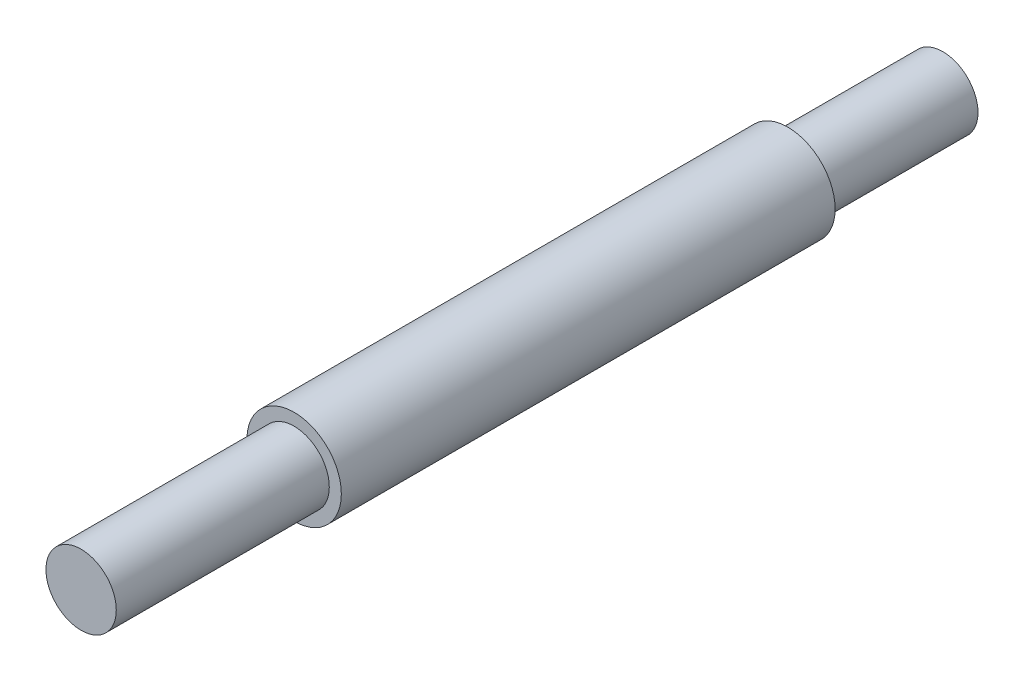
ISO-10303-21;
HEADER;
FILE_DESCRIPTION(('STEP AP214'),'2;1');
FILE_NAME('part.step','',(''),(''),'','','');
FILE_SCHEMA(('AUTOMOTIVE_DESIGN { 1 0 10303 214 1 1 1 1 }'));
ENDSEC;
DATA;
#1=APPLICATION_CONTEXT('core data for automotive mechanical design processes');
#2=APPLICATION_PROTOCOL_DEFINITION('international standard','automotive_design',2000,#1);
#3=PRODUCT_CONTEXT('',#1,'mechanical');
#4=PRODUCT('Part','Part','',(#3));
#5=PRODUCT_RELATED_PRODUCT_CATEGORY('part','',(#4));
#6=PRODUCT_DEFINITION_FORMATION('','',#4);
#7=PRODUCT_DEFINITION_CONTEXT('part definition',#1,'design');
#8=PRODUCT_DEFINITION('design','',#6,#7);
#9=PRODUCT_DEFINITION_SHAPE('','',#8);
#10=(LENGTH_UNIT() NAMED_UNIT(*) SI_UNIT(.MILLI.,.METRE.));
#11=(NAMED_UNIT(*) PLANE_ANGLE_UNIT() SI_UNIT($,.RADIAN.));
#12=(NAMED_UNIT(*) SI_UNIT($,.STERADIAN.) SOLID_ANGLE_UNIT());
#13=UNCERTAINTY_MEASURE_WITH_UNIT(LENGTH_MEASURE(1.E-05),#10,'distance_accuracy_value','');
#14=(GEOMETRIC_REPRESENTATION_CONTEXT(3) GLOBAL_UNCERTAINTY_ASSIGNED_CONTEXT((#13)) GLOBAL_UNIT_ASSIGNED_CONTEXT((#10,
#11,#12)) REPRESENTATION_CONTEXT('',''));
#15=CARTESIAN_POINT('',(0.,0.,0.));
#16=DIRECTION('',(0.,0.,1.));
#17=DIRECTION('',(1.,0.,0.));
#18=AXIS2_PLACEMENT_3D('',#15,#16,#17);
#19=CARTESIAN_POINT('',(0.,0.,25.49906));
#20=DIRECTION('',(0.,0.,1.));
#21=DIRECTION('',(1.,0.,0.));
#22=AXIS2_PLACEMENT_3D('',#19,#20,#21);
#23=PLANE('',#22);
#24=CARTESIAN_POINT('',(0.,0.,25.49906));
#25=DIRECTION('',(0.,0.,1.));
#26=DIRECTION('',(1.,0.,0.));
#27=AXIS2_PLACEMENT_3D('',#24,#25,#26);
#28=CIRCLE('',#27,1.8161);
#29=CARTESIAN_POINT('',(1.8161,0.,25.49906));
#30=VERTEX_POINT('',#29);
#31=EDGE_CURVE('E69',#30,#30,#28,.T.);
#32=ORIENTED_EDGE('',*,*,#31,.F.);
#33=EDGE_LOOP('',(#32));
#34=FACE_BOUND('',#33,.T.);
#35=CARTESIAN_POINT('',(0.,0.,25.49906));
#36=DIRECTION('',(0.,0.,1.));
#37=DIRECTION('',(1.,0.,0.));
#38=AXIS2_PLACEMENT_3D('',#35,#36,#37);
#39=CIRCLE('',#38,2.4384);
#40=CARTESIAN_POINT('',(2.4384,0.,25.49906));
#41=VERTEX_POINT('',#40);
#42=EDGE_CURVE('E54',#41,#41,#39,.T.);
#43=ORIENTED_EDGE('',*,*,#42,.T.);
#44=EDGE_LOOP('',(#43));
#45=FACE_BOUND('',#44,.T.);
#46=ADVANCED_FACE('F46',(#34,#45),#23,.T.);
#47=CARTESIAN_POINT('',(0.,0.,0.));
#48=DIRECTION('',(0.,0.,1.));
#49=DIRECTION('',(1.,0.,0.));
#50=AXIS2_PLACEMENT_3D('',#47,#48,#49);
#51=PLANE('',#50);
#52=CARTESIAN_POINT('',(0.,0.,0.));
#53=DIRECTION('',(0.,0.,1.));
#54=DIRECTION('',(1.,0.,0.));
#55=AXIS2_PLACEMENT_3D('',#52,#53,#54);
#56=CIRCLE('',#55,1.8161);
#57=CARTESIAN_POINT('',(1.8161,0.,0.));
#58=VERTEX_POINT('',#57);
#59=EDGE_CURVE('E10',#58,#58,#56,.F.);
#60=ORIENTED_EDGE('',*,*,#59,.F.);
#61=EDGE_LOOP('',(#60));
#62=FACE_BOUND('',#61,.T.);
#63=CARTESIAN_POINT('',(0.,0.,0.));
#64=DIRECTION('',(0.,0.,1.));
#65=DIRECTION('',(1.,0.,0.));
#66=AXIS2_PLACEMENT_3D('',#63,#64,#65);
#67=CIRCLE('',#66,2.4384);
#68=CARTESIAN_POINT('',(2.4384,0.,0.));
#69=VERTEX_POINT('',#68);
#70=EDGE_CURVE('E58',#69,#69,#67,.T.);
#71=ORIENTED_EDGE('',*,*,#70,.F.);
#72=EDGE_LOOP('',(#71));
#73=FACE_BOUND('',#72,.T.);
#74=ADVANCED_FACE('F106',(#62,#73),#51,.F.);
#75=CARTESIAN_POINT('',(0.,0.,25.49906));
#76=DIRECTION('',(0.,0.,-1.));
#77=DIRECTION('',(-1.,0.,0.));
#78=AXIS2_PLACEMENT_3D('',#75,#76,#77);
#79=CYLINDRICAL_SURFACE('',#78,2.4384);
#80=ORIENTED_EDGE('',*,*,#42,.F.);
#81=EDGE_LOOP('',(#80));
#82=FACE_BOUND('',#81,.T.);
#83=ORIENTED_EDGE('',*,*,#70,.T.);
#84=EDGE_LOOP('',(#83));
#85=FACE_BOUND('',#84,.T.);
#86=ADVANCED_FACE('F48',(#82,#85),#79,.T.);
#87=CARTESIAN_POINT('',(0.,0.,36.49906));
#88=DIRECTION('',(0.,0.,-1.));
#89=DIRECTION('',(-1.,0.,0.));
#90=AXIS2_PLACEMENT_3D('',#87,#88,#89);
#91=CYLINDRICAL_SURFACE('',#90,1.8161);
#92=CARTESIAN_POINT('',(0.,0.,36.49906));
#93=DIRECTION('',(0.,0.,1.));
#94=DIRECTION('',(1.,0.,0.));
#95=AXIS2_PLACEMENT_3D('',#92,#93,#94);
#96=CIRCLE('',#95,1.8161);
#97=CARTESIAN_POINT('',(1.8161,0.,36.49906));
#98=VERTEX_POINT('',#97);
#99=EDGE_CURVE('E74',#98,#98,#96,.T.);
#100=ORIENTED_EDGE('',*,*,#99,.F.);
#101=EDGE_LOOP('',(#100));
#102=FACE_BOUND('',#101,.T.);
#103=ORIENTED_EDGE('',*,*,#31,.T.);
#104=EDGE_LOOP('',(#103));
#105=FACE_BOUND('',#104,.T.);
#106=ADVANCED_FACE('F103',(#102,#105),#91,.T.);
#107=CARTESIAN_POINT('',(0.,0.,36.49906));
#108=DIRECTION('',(0.,0.,1.));
#109=DIRECTION('',(1.,0.,0.));
#110=AXIS2_PLACEMENT_3D('',#107,#108,#109);
#111=PLANE('',#110);
#112=ORIENTED_EDGE('',*,*,#99,.T.);
#113=EDGE_LOOP('',(#112));
#114=FACE_BOUND('',#113,.T.);
#115=ADVANCED_FACE('F101',(#114),#111,.T.);
#116=CARTESIAN_POINT('',(0.,0.,-8.));
#117=DIRECTION('',(0.,0.,1.));
#118=DIRECTION('',(1.,0.,0.));
#119=AXIS2_PLACEMENT_3D('',#116,#117,#118);
#120=CYLINDRICAL_SURFACE('',#119,1.8161);
#121=CARTESIAN_POINT('',(0.,0.,-8.));
#122=DIRECTION('',(0.,0.,-1.));
#123=DIRECTION('',(-1.,0.,0.));
#124=AXIS2_PLACEMENT_3D('',#121,#122,#123);
#125=CIRCLE('',#124,1.8161);
#126=CARTESIAN_POINT('',(-1.8161,0.,-8.));
#127=VERTEX_POINT('',#126);
#128=EDGE_CURVE('E70',#127,#127,#125,.T.);
#129=ORIENTED_EDGE('',*,*,#128,.F.);
#130=EDGE_LOOP('',(#129));
#131=FACE_BOUND('',#130,.T.);
#132=ORIENTED_EDGE('',*,*,#59,.T.);
#133=EDGE_LOOP('',(#132));
#134=FACE_BOUND('',#133,.T.);
#135=ADVANCED_FACE('F144',(#131,#134),#120,.T.);
#136=CARTESIAN_POINT('',(0.,0.,-8.));
#137=DIRECTION('',(0.,0.,-1.));
#138=DIRECTION('',(-1.,0.,0.));
#139=AXIS2_PLACEMENT_3D('',#136,#137,#138);
#140=PLANE('',#139);
#141=ORIENTED_EDGE('',*,*,#128,.T.);
#142=EDGE_LOOP('',(#141));
#143=FACE_BOUND('',#142,.T.);
#144=ADVANCED_FACE('F157',(#143),#140,.T.);
#145=CLOSED_SHELL('',(#46,#74,#86,#106,#115,#135,#144));
#146=CARTESIAN_POINT('',(0.,0.,25.49906));
#147=DIRECTION('',(0.,0.,1.));
#148=DIRECTION('',(1.,0.,0.));
#149=AXIS2_PLACEMENT_3D('',#146,#147,#148);
#150=PLANE('',#149);
#151=CARTESIAN_POINT('',(0.,0.,25.49906));
#152=DIRECTION('',(0.,0.,1.));
#153=DIRECTION('',(1.,0.,0.));
#154=AXIS2_PLACEMENT_3D('',#151,#152,#153);
#155=CIRCLE('',#154,1.397);
#156=CARTESIAN_POINT('',(1.397,0.,25.49906));
#157=VERTEX_POINT('',#156);
#158=EDGE_CURVE('E63',#157,#157,#155,.T.);
#159=ORIENTED_EDGE('',*,*,#158,.F.);
#160=EDGE_LOOP('',(#159));
#161=FACE_BOUND('',#160,.T.);
#162=ADVANCED_FACE('F88',(#161),#150,.F.);
#163=CARTESIAN_POINT('',(0.,0.,25.49906));
#164=DIRECTION('',(0.,0.,-1.));
#165=DIRECTION('',(-1.,0.,0.));
#166=AXIS2_PLACEMENT_3D('',#163,#164,#165);
#167=CYLINDRICAL_SURFACE('',#166,1.397);
#168=ORIENTED_EDGE('',*,*,#158,.T.);
#169=EDGE_LOOP('',(#168));
#170=FACE_BOUND('',#169,.T.);
#171=CARTESIAN_POINT('',(0.,0.,8.));
#172=DIRECTION('',(0.,0.,-1.));
#173=DIRECTION('',(-1.,0.,0.));
#174=AXIS2_PLACEMENT_3D('',#171,#172,#173);
#175=CIRCLE('',#174,1.397);
#176=CARTESIAN_POINT('',(-1.397,0.,8.));
#177=VERTEX_POINT('',#176);
#178=EDGE_CURVE('E67',#177,#177,#175,.T.);
#179=ORIENTED_EDGE('',*,*,#178,.T.);
#180=EDGE_LOOP('',(#179));
#181=FACE_BOUND('',#180,.T.);
#182=ADVANCED_FACE('F86',(#170,#181),#167,.F.);
#183=CARTESIAN_POINT('',(0.,0.,8.));
#184=DIRECTION('',(0.,0.,-1.));
#185=DIRECTION('',(-1.,0.,0.));
#186=AXIS2_PLACEMENT_3D('',#183,#184,#185);
#187=PLANE('',#186);
#188=ORIENTED_EDGE('',*,*,#178,.F.);
#189=EDGE_LOOP('',(#188));
#190=FACE_BOUND('',#189,.T.);
#191=ADVANCED_FACE('F97',(#190),#187,.F.);
#192=CLOSED_SHELL('',(#162,#182,#191));
#193=ORIENTED_CLOSED_SHELL('',*,#192,.T.);
#194=BREP_WITH_VOIDS('B2',#145,(#193));
#195=ADVANCED_BREP_SHAPE_REPRESENTATION('',(#18,#194),#14);
#196=SHAPE_DEFINITION_REPRESENTATION(#9,#195);
ENDSEC;
END-ISO-10303-21;
